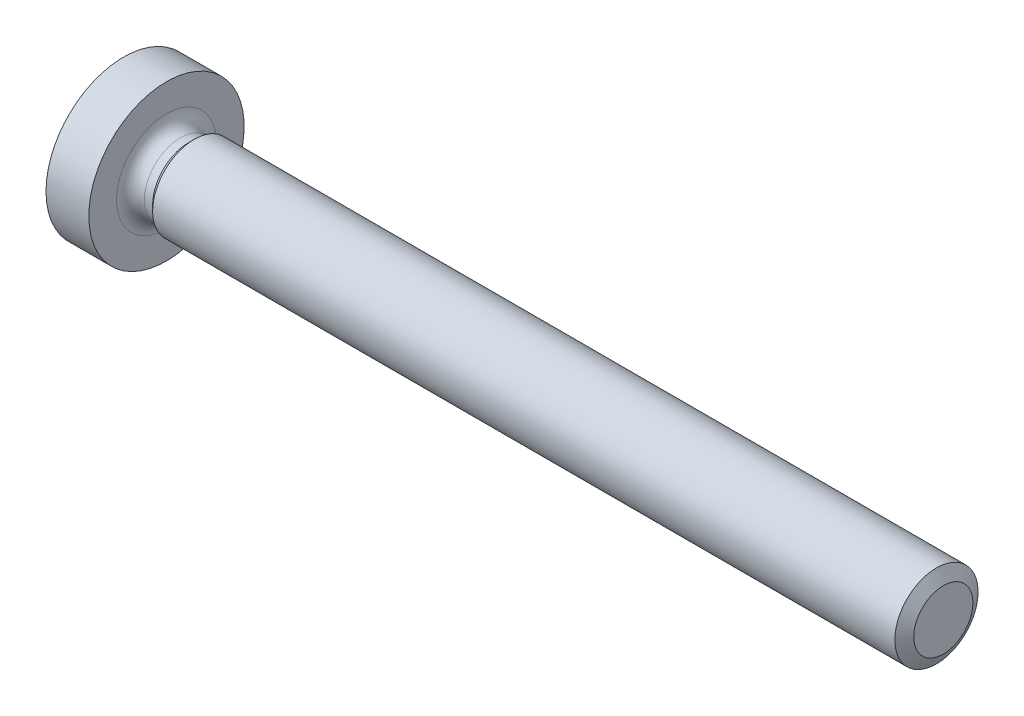
ISO-10303-21;
HEADER;
FILE_DESCRIPTION(('STEP AP214'),'2;1');
FILE_NAME('part.step','',(''),(''),'','','');
FILE_SCHEMA(('AUTOMOTIVE_DESIGN { 1 0 10303 214 1 1 1 1 }'));
ENDSEC;
DATA;
#1=APPLICATION_CONTEXT('core data for automotive mechanical design processes');
#2=APPLICATION_PROTOCOL_DEFINITION('international standard','automotive_design',2000,#1);
#3=PRODUCT_CONTEXT('',#1,'mechanical');
#4=PRODUCT('Part','Part','',(#3));
#5=PRODUCT_RELATED_PRODUCT_CATEGORY('part','',(#4));
#6=PRODUCT_DEFINITION_FORMATION('','',#4);
#7=PRODUCT_DEFINITION_CONTEXT('part definition',#1,'design');
#8=PRODUCT_DEFINITION('design','',#6,#7);
#9=PRODUCT_DEFINITION_SHAPE('','',#8);
#10=(LENGTH_UNIT() NAMED_UNIT(*) SI_UNIT(.MILLI.,.METRE.));
#11=(NAMED_UNIT(*) PLANE_ANGLE_UNIT() SI_UNIT($,.RADIAN.));
#12=(NAMED_UNIT(*) SI_UNIT($,.STERADIAN.) SOLID_ANGLE_UNIT());
#13=UNCERTAINTY_MEASURE_WITH_UNIT(LENGTH_MEASURE(1.E-05),#10,'distance_accuracy_value','');
#14=(GEOMETRIC_REPRESENTATION_CONTEXT(3) GLOBAL_UNCERTAINTY_ASSIGNED_CONTEXT((#13)) GLOBAL_UNIT_ASSIGNED_CONTEXT((#10,
#11,#12)) REPRESENTATION_CONTEXT('',''));
#15=CARTESIAN_POINT('',(0.,0.,0.));
#16=DIRECTION('',(0.,0.,1.));
#17=DIRECTION('',(1.,0.,0.));
#18=AXIS2_PLACEMENT_3D('',#15,#16,#17);
#19=CARTESIAN_POINT('',(1.8,0.,0.));
#20=DIRECTION('',(0.137568371274688,0.,-0.990492273177751));
#21=DIRECTION('',(-0.990492273177752,0.,-0.137568371274688));
#22=AXIS2_PLACEMENT_3D('',#19,#20,#21);
#23=PLANE('',#22);
#24=DIRECTION('',(-0.763885421064628,-0.636571184220523,-0.106095197370087));
#25=VECTOR('',#24,1.);
#26=CARTESIAN_POINT('',(1.8,0.,0.));
#27=LINE('',#26,#25);
#28=CARTESIAN_POINT('',(1.8,0.,0.));
#29=VERTEX_POINT('',#28);
#30=CARTESIAN_POINT('',(0.188839901093437,-1.34263341575547,-0.223772235959245));
#31=VERTEX_POINT('',#30);
#32=EDGE_CURVE('E168',#29,#31,#27,.T.);
#33=ORIENTED_EDGE('',*,*,#32,.F.);
#34=DIRECTION('',(-0.981250680241291,-0.136284816700179,-0.136284816700179));
#35=VECTOR('',#34,1.);
#36=CARTESIAN_POINT('',(1.8,0.,0.));
#37=LINE('',#36,#35);
#38=CARTESIAN_POINT('',(0.0123443765883179,-0.248285503251622,-0.248285503251623));
#39=VERTEX_POINT('',#38);
#40=EDGE_CURVE('E129',#29,#39,#37,.T.);
#41=ORIENTED_EDGE('',*,*,#40,.T.);
#42=CARTESIAN_POINT('',(4.93943981831946,0.,0.436033308099924));
#43=DIRECTION('',(0.137568371274688,0.,-0.990492273177751));
#44=DIRECTION('',(-0.990492273177752,0.,-0.137568371274688));
#45=AXIS2_PLACEMENT_3D('',#42,#43,#44);
#46=CIRCLE('',#45,4.98058304002877);
#47=EDGE_CURVE('E142',#31,#39,#46,.T.);
#48=ORIENTED_EDGE('',*,*,#47,.F.);
#49=EDGE_LOOP('',(#33,#41,#48));
#50=FACE_BOUND('',#49,.T.);
#51=ADVANCED_FACE('F49',(#50),#23,.F.);
#52=CARTESIAN_POINT('',(1.8,0.,0.));
#53=DIRECTION('',(0.137568371274688,0.,0.990492273177752));
#54=DIRECTION('',(0.990492273177752,0.,-0.137568371274688));
#55=AXIS2_PLACEMENT_3D('',#52,#53,#54);
#56=PLANE('',#55);
#57=CARTESIAN_POINT('',(4.93943981831946,0.,-0.436033308099924));
#58=DIRECTION('',(0.137568371274688,0.,0.990492273177752));
#59=DIRECTION('',(0.990492273177752,0.,-0.137568371274688));
#60=AXIS2_PLACEMENT_3D('',#57,#58,#59);
#61=CIRCLE('',#60,4.98058304002877);
#62=CARTESIAN_POINT('',(0.0123443765883179,-0.248285503251624,0.248285503251622));
#63=VERTEX_POINT('',#62);
#64=CARTESIAN_POINT('',(0.188839901093437,-1.34263341575547,0.223772235959245));
#65=VERTEX_POINT('',#64);
#66=EDGE_CURVE('E72',#63,#65,#61,.T.);
#67=ORIENTED_EDGE('',*,*,#66,.F.);
#68=DIRECTION('',(0.981250680241291,0.13628481670018,-0.136284816700179));
#69=VECTOR('',#68,1.);
#70=CARTESIAN_POINT('',(1.8,0.,0.));
#71=LINE('',#70,#69);
#72=EDGE_CURVE('E13',#63,#29,#71,.T.);
#73=ORIENTED_EDGE('',*,*,#72,.T.);
#74=DIRECTION('',(-0.763885421064628,-0.636571184220523,0.106095197370087));
#75=VECTOR('',#74,1.);
#76=CARTESIAN_POINT('',(1.8,0.,0.));
#77=LINE('',#76,#75);
#78=EDGE_CURVE('E169',#29,#65,#77,.T.);
#79=ORIENTED_EDGE('',*,*,#78,.T.);
#80=EDGE_LOOP('',(#67,#73,#79));
#81=FACE_BOUND('',#80,.T.);
#82=ADVANCED_FACE('F184',(#81),#56,.F.);
#83=CARTESIAN_POINT('',(-1.33175770411172,0.,0.));
#84=DIRECTION('',(-1.,0.,0.));
#85=DIRECTION('',(0.,0.,1.));
#86=AXIS2_PLACEMENT_3D('',#83,#84,#85);
#87=CYLINDRICAL_SURFACE('',#86,1.5);
#88=CARTESIAN_POINT('',(3.4,0.,0.));
#89=DIRECTION('',(-1.,0.,0.));
#90=DIRECTION('',(0.,0.,1.));
#91=AXIS2_PLACEMENT_3D('',#88,#89,#90);
#92=CIRCLE('',#91,1.5);
#93=CARTESIAN_POINT('',(3.4,0.,1.5));
#94=VERTEX_POINT('',#93);
#95=EDGE_CURVE('E205',#94,#94,#92,.T.);
#96=ORIENTED_EDGE('',*,*,#95,.F.);
#97=EDGE_LOOP('',(#96));
#98=FACE_BOUND('',#97,.T.);
#99=CARTESIAN_POINT('',(30.1527080028722,0.,0.));
#100=DIRECTION('',(-1.,0.,0.));
#101=DIRECTION('',(0.,0.,1.));
#102=AXIS2_PLACEMENT_3D('',#99,#100,#101);
#103=CIRCLE('',#102,1.5);
#104=CARTESIAN_POINT('',(30.1527080028722,0.,1.5));
#105=VERTEX_POINT('',#104);
#106=EDGE_CURVE('E202',#105,#105,#103,.T.);
#107=ORIENTED_EDGE('',*,*,#106,.T.);
#108=EDGE_LOOP('',(#107));
#109=FACE_BOUND('',#108,.T.);
#110=ADVANCED_FACE('F249',(#98,#109),#87,.T.);
#111=CARTESIAN_POINT('',(5.,0.,0.));
#112=DIRECTION('',(-1.,0.,0.));
#113=DIRECTION('',(0.,1.,0.));
#114=AXIS2_PLACEMENT_3D('',#111,#112,#113);
#115=SPHERICAL_SURFACE('',#114,5.);
#116=CARTESIAN_POINT('',(3.68852459016393,0.,-1.57377049180328));
#117=DIRECTION('',(0.64018439966448,0.,0.768221279597376));
#118=DIRECTION('',(0.768221279597376,0.,-0.64018439966448));
#119=AXIS2_PLACEMENT_3D('',#116,#117,#118);
#120=CIRCLE('',#119,4.56106113624062);
#121=CARTESIAN_POINT('',(0.188839901093437,0.22377223595924,1.34263341575547));
#122=VERTEX_POINT('',#121);
#123=CARTESIAN_POINT('',(0.188839901093437,-0.22377223595925,1.34263341575547));
#124=VERTEX_POINT('',#123);
#125=EDGE_CURVE('E135',#122,#124,#120,.T.);
#126=ORIENTED_EDGE('',*,*,#125,.T.);
#127=CARTESIAN_POINT('',(4.93943981831946,0.436033308099924,0.));
#128=DIRECTION('',(0.137568371274688,-0.990492273177751,0.));
#129=DIRECTION('',(0.990492273177752,0.137568371274688,0.));
#130=AXIS2_PLACEMENT_3D('',#127,#128,#129);
#131=CIRCLE('',#130,4.98058304002877);
#132=EDGE_CURVE('E151',#124,#63,#131,.T.);
#133=ORIENTED_EDGE('',*,*,#132,.T.);
#134=ORIENTED_EDGE('',*,*,#66,.T.);
#135=CARTESIAN_POINT('',(3.68852459016393,1.57377049180328,0.));
#136=DIRECTION('',(0.64018439966448,-0.768221279597376,0.));
#137=DIRECTION('',(0.768221279597376,0.64018439966448,0.));
#138=AXIS2_PLACEMENT_3D('',#135,#136,#137);
#139=CIRCLE('',#138,4.56106113624062);
#140=EDGE_CURVE('E181',#65,#31,#139,.T.);
#141=ORIENTED_EDGE('',*,*,#140,.T.);
#142=ORIENTED_EDGE('',*,*,#47,.T.);
#143=CARTESIAN_POINT('',(0.188839901093437,-0.22377223595924,-1.34263341575547));
#144=VERTEX_POINT('',#143);
#145=EDGE_CURVE('E131',#39,#144,#131,.T.);
#146=ORIENTED_EDGE('',*,*,#145,.T.);
#147=CARTESIAN_POINT('',(3.68852459016393,0.,1.57377049180328));
#148=DIRECTION('',(0.64018439966448,0.,-0.768221279597376));
#149=DIRECTION('',(-0.768221279597376,0.,-0.64018439966448));
#150=AXIS2_PLACEMENT_3D('',#147,#148,#149);
#151=CIRCLE('',#150,4.56106113624062);
#152=CARTESIAN_POINT('',(0.188839901093437,0.223772235959249,-1.34263341575547));
#153=VERTEX_POINT('',#152);
#154=EDGE_CURVE('E123',#144,#153,#151,.T.);
#155=ORIENTED_EDGE('',*,*,#154,.T.);
#156=CARTESIAN_POINT('',(4.93943981831946,-0.436033308099924,0.));
#157=DIRECTION('',(0.137568371274688,0.990492273177752,0.));
#158=DIRECTION('',(-0.990492273177752,0.137568371274688,0.));
#159=AXIS2_PLACEMENT_3D('',#156,#157,#158);
#160=CIRCLE('',#159,4.98058304002877);
#161=CARTESIAN_POINT('',(0.0123443765883179,0.248285503251624,-0.248285503251623));
#162=VERTEX_POINT('',#161);
#163=EDGE_CURVE('E114',#153,#162,#160,.T.);
#164=ORIENTED_EDGE('',*,*,#163,.T.);
#165=CARTESIAN_POINT('',(0.188839901093437,1.34263341575547,-0.223772235959245));
#166=VERTEX_POINT('',#165);
#167=EDGE_CURVE('E159',#162,#166,#46,.T.);
#168=ORIENTED_EDGE('',*,*,#167,.T.);
#169=CARTESIAN_POINT('',(3.68852459016393,-1.57377049180328,0.));
#170=DIRECTION('',(0.64018439966448,0.768221279597376,0.));
#171=DIRECTION('',(-0.768221279597376,0.64018439966448,0.));
#172=AXIS2_PLACEMENT_3D('',#169,#170,#171);
#173=CIRCLE('',#172,4.56106113624062);
#174=CARTESIAN_POINT('',(0.188839901093437,1.34263341575547,0.223772235959245));
#175=VERTEX_POINT('',#174);
#176=EDGE_CURVE('E172',#166,#175,#173,.T.);
#177=ORIENTED_EDGE('',*,*,#176,.T.);
#178=CARTESIAN_POINT('',(0.0123443765883179,0.248285503251622,0.248285503251622));
#179=VERTEX_POINT('',#178);
#180=EDGE_CURVE('E164',#175,#179,#61,.T.);
#181=ORIENTED_EDGE('',*,*,#180,.T.);
#182=EDGE_CURVE('E64',#179,#122,#160,.T.);
#183=ORIENTED_EDGE('',*,*,#182,.T.);
#184=EDGE_LOOP('',(#126,#133,#134,#141,#142,#146,#155,#164,#168,#177,#181,#183));
#185=FACE_BOUND('',#184,.T.);
#186=CARTESIAN_POINT('',(0.857536964558404,0.,0.));
#187=DIRECTION('',(-1.,0.,0.));
#188=DIRECTION('',(0.,0.,1.));
#189=AXIS2_PLACEMENT_3D('',#186,#187,#188);
#190=CIRCLE('',#189,2.8);
#191=CARTESIAN_POINT('',(0.857536964558404,0.,2.8));
#192=VERTEX_POINT('',#191);
#193=EDGE_CURVE('E185',#192,#192,#190,.T.);
#194=ORIENTED_EDGE('',*,*,#193,.T.);
#195=EDGE_LOOP('',(#194));
#196=FACE_BOUND('',#195,.T.);
#197=ADVANCED_FACE('F51',(#185,#196),#115,.T.);
#198=CARTESIAN_POINT('',(-1.33175770411172,0.,0.));
#199=DIRECTION('',(-1.,0.,0.));
#200=DIRECTION('',(0.,0.,1.));
#201=AXIS2_PLACEMENT_3D('',#198,#199,#200);
#202=CYLINDRICAL_SURFACE('',#201,2.8);
#203=ORIENTED_EDGE('',*,*,#193,.F.);
#204=EDGE_LOOP('',(#203));
#205=FACE_BOUND('',#204,.T.);
#206=CARTESIAN_POINT('',(2.4,0.,0.));
#207=DIRECTION('',(-1.,0.,0.));
#208=DIRECTION('',(0.,0.,1.));
#209=AXIS2_PLACEMENT_3D('',#206,#207,#208);
#210=CIRCLE('',#209,2.8);
#211=CARTESIAN_POINT('',(2.4,0.,2.8));
#212=VERTEX_POINT('',#211);
#213=EDGE_CURVE('E188',#212,#212,#210,.T.);
#214=ORIENTED_EDGE('',*,*,#213,.T.);
#215=EDGE_LOOP('',(#214));
#216=FACE_BOUND('',#215,.T.);
#217=ADVANCED_FACE('F222',(#205,#216),#202,.T.);
#218=CARTESIAN_POINT('',(2.4,1.8,0.));
#219=DIRECTION('',(-1.,0.,0.));
#220=DIRECTION('',(0.,0.,1.));
#221=AXIS2_PLACEMENT_3D('',#218,#219,#220);
#222=PLANE('',#221);
#223=ORIENTED_EDGE('',*,*,#213,.F.);
#224=EDGE_LOOP('',(#223));
#225=FACE_BOUND('',#224,.T.);
#226=CARTESIAN_POINT('',(2.4,0.,0.));
#227=DIRECTION('',(-1.,0.,0.));
#228=DIRECTION('',(0.,0.,1.));
#229=AXIS2_PLACEMENT_3D('',#226,#227,#228);
#230=CIRCLE('',#229,1.8);
#231=CARTESIAN_POINT('',(2.4,0.,1.8));
#232=VERTEX_POINT('',#231);
#233=EDGE_CURVE('E214',#232,#232,#230,.T.);
#234=ORIENTED_EDGE('',*,*,#233,.T.);
#235=EDGE_LOOP('',(#234));
#236=FACE_BOUND('',#235,.T.);
#237=ADVANCED_FACE('F224',(#225,#236),#222,.F.);
#238=CARTESIAN_POINT('',(2.901,0.,0.));
#239=DIRECTION('',(-1.,0.,0.));
#240=DIRECTION('',(0.,0.,1.));
#241=AXIS2_PLACEMENT_3D('',#238,#239,#240);
#242=TOROIDAL_SURFACE('',#241,1.8,0.501);
#243=ORIENTED_EDGE('',*,*,#233,.F.);
#244=EDGE_LOOP('',(#243));
#245=FACE_BOUND('',#244,.T.);
#246=CARTESIAN_POINT('',(2.901,0.,0.));
#247=DIRECTION('',(-1.,0.,0.));
#248=DIRECTION('',(0.,0.,1.));
#249=AXIS2_PLACEMENT_3D('',#246,#247,#248);
#250=CIRCLE('',#249,1.299);
#251=CARTESIAN_POINT('',(2.901,0.,1.299));
#252=VERTEX_POINT('',#251);
#253=EDGE_CURVE('E211',#252,#252,#250,.T.);
#254=ORIENTED_EDGE('',*,*,#253,.T.);
#255=EDGE_LOOP('',(#254));
#256=FACE_BOUND('',#255,.T.);
#257=ADVANCED_FACE('F227',(#245,#256),#242,.F.);
#258=CARTESIAN_POINT('',(-1.33175770411172,0.,0.));
#259=DIRECTION('',(-1.,0.,0.));
#260=DIRECTION('',(0.,0.,1.));
#261=AXIS2_PLACEMENT_3D('',#258,#259,#260);
#262=CYLINDRICAL_SURFACE('',#261,1.299);
#263=ORIENTED_EDGE('',*,*,#253,.F.);
#264=EDGE_LOOP('',(#263));
#265=FACE_BOUND('',#264,.T.);
#266=CARTESIAN_POINT('',(3.199,0.,0.));
#267=DIRECTION('',(-1.,0.,0.));
#268=DIRECTION('',(0.,0.,1.));
#269=AXIS2_PLACEMENT_3D('',#266,#267,#268);
#270=CIRCLE('',#269,1.299);
#271=CARTESIAN_POINT('',(3.199,0.,1.299));
#272=VERTEX_POINT('',#271);
#273=EDGE_CURVE('E208',#272,#272,#270,.T.);
#274=ORIENTED_EDGE('',*,*,#273,.T.);
#275=EDGE_LOOP('',(#274));
#276=FACE_BOUND('',#275,.T.);
#277=ADVANCED_FACE('F233',(#265,#276),#262,.T.);
#278=CARTESIAN_POINT('',(3.4,0.,0.));
#279=DIRECTION('',(1.,0.,0.));
#280=DIRECTION('',(0.,0.,-1.));
#281=AXIS2_PLACEMENT_3D('',#278,#279,#280);
#282=CONICAL_SURFACE('',#281,1.5,0.785398163397443);
#283=ORIENTED_EDGE('',*,*,#273,.F.);
#284=EDGE_LOOP('',(#283));
#285=FACE_BOUND('',#284,.T.);
#286=ORIENTED_EDGE('',*,*,#95,.T.);
#287=EDGE_LOOP('',(#286));
#288=FACE_BOUND('',#287,.T.);
#289=ADVANCED_FACE('F239',(#285,#288),#282,.T.);
#290=CARTESIAN_POINT('',(30.1527080028722,0.,0.));
#291=DIRECTION('',(-1.,0.,0.));
#292=DIRECTION('',(0.,0.,1.));
#293=AXIS2_PLACEMENT_3D('',#290,#291,#292);
#294=CONICAL_SURFACE('',#293,1.5,1.05188801855298);
#295=CARTESIAN_POINT('',(30.4,0.,0.));
#296=DIRECTION('',(-1.,0.,0.));
#297=DIRECTION('',(0.,0.,1.));
#298=AXIS2_PLACEMENT_3D('',#295,#296,#297);
#299=CIRCLE('',#298,1.067);
#300=CARTESIAN_POINT('',(30.4,0.,1.067));
#301=VERTEX_POINT('',#300);
#302=EDGE_CURVE('E173',#301,#301,#299,.T.);
#303=ORIENTED_EDGE('',*,*,#302,.T.);
#304=EDGE_LOOP('',(#303));
#305=FACE_BOUND('',#304,.T.);
#306=ORIENTED_EDGE('',*,*,#106,.F.);
#307=EDGE_LOOP('',(#306));
#308=FACE_BOUND('',#307,.T.);
#309=ADVANCED_FACE('F245',(#305,#308),#294,.T.);
#310=CARTESIAN_POINT('',(30.4,0.,0.));
#311=DIRECTION('',(-1.,0.,0.));
#312=DIRECTION('',(0.,0.,1.));
#313=AXIS2_PLACEMENT_3D('',#310,#311,#312);
#314=PLANE('',#313);
#315=ORIENTED_EDGE('',*,*,#302,.F.);
#316=EDGE_LOOP('',(#315));
#317=FACE_BOUND('',#316,.T.);
#318=ADVANCED_FACE('F256',(#317),#314,.F.);
#319=ORIENTED_EDGE('',*,*,#167,.F.);
#320=DIRECTION('',(0.981250680241291,-0.13628481670018,0.136284816700179));
#321=VECTOR('',#320,1.);
#322=CARTESIAN_POINT('',(1.8,0.,0.));
#323=LINE('',#322,#321);
#324=EDGE_CURVE('E112',#162,#29,#323,.T.);
#325=ORIENTED_EDGE('',*,*,#324,.T.);
#326=DIRECTION('',(-0.763885421064628,0.636571184220523,-0.106095197370087));
#327=VECTOR('',#326,1.);
#328=CARTESIAN_POINT('',(1.8,0.,0.));
#329=LINE('',#328,#327);
#330=EDGE_CURVE('E158',#29,#166,#329,.T.);
#331=ORIENTED_EDGE('',*,*,#330,.T.);
#332=EDGE_LOOP('',(#319,#325,#331));
#333=FACE_BOUND('',#332,.T.);
#334=ADVANCED_FACE('F156',(#333),#23,.F.);
#335=CARTESIAN_POINT('',(0.,1.5,-0.25));
#336=DIRECTION('',(0.64018439966448,0.768221279597376,0.));
#337=DIRECTION('',(-0.768221279597376,0.64018439966448,0.));
#338=AXIS2_PLACEMENT_3D('',#335,#336,#337);
#339=PLANE('',#338);
#340=ORIENTED_EDGE('',*,*,#330,.F.);
#341=DIRECTION('',(-0.763885421064628,0.636571184220523,0.106095197370087));
#342=VECTOR('',#341,1.);
#343=CARTESIAN_POINT('',(1.8,0.,0.));
#344=LINE('',#343,#342);
#345=EDGE_CURVE('E162',#29,#175,#344,.T.);
#346=ORIENTED_EDGE('',*,*,#345,.T.);
#347=ORIENTED_EDGE('',*,*,#176,.F.);
#348=EDGE_LOOP('',(#340,#346,#347));
#349=FACE_BOUND('',#348,.T.);
#350=ADVANCED_FACE('F171',(#349),#339,.F.);
#351=CARTESIAN_POINT('',(0.,-1.5,0.25));
#352=DIRECTION('',(0.64018439966448,-0.768221279597376,0.));
#353=DIRECTION('',(0.768221279597376,0.64018439966448,0.));
#354=AXIS2_PLACEMENT_3D('',#351,#352,#353);
#355=PLANE('',#354);
#356=ORIENTED_EDGE('',*,*,#78,.F.);
#357=ORIENTED_EDGE('',*,*,#32,.T.);
#358=ORIENTED_EDGE('',*,*,#140,.F.);
#359=EDGE_LOOP('',(#356,#357,#358));
#360=FACE_BOUND('',#359,.T.);
#361=ADVANCED_FACE('F180',(#360),#355,.F.);
#362=ORIENTED_EDGE('',*,*,#345,.F.);
#363=DIRECTION('',(-0.981250680241291,0.136284816700179,0.136284816700179));
#364=VECTOR('',#363,1.);
#365=CARTESIAN_POINT('',(1.8,0.,0.));
#366=LINE('',#365,#364);
#367=EDGE_CURVE('E57',#29,#179,#366,.T.);
#368=ORIENTED_EDGE('',*,*,#367,.T.);
#369=ORIENTED_EDGE('',*,*,#180,.F.);
#370=EDGE_LOOP('',(#362,#368,#369));
#371=FACE_BOUND('',#370,.T.);
#372=ADVANCED_FACE('F163',(#371),#56,.F.);
#373=CARTESIAN_POINT('',(1.8,0.,0.));
#374=DIRECTION('',(0.137568371274688,-0.990492273177751,0.));
#375=DIRECTION('',(-0.990492273177752,-0.137568371274688,0.));
#376=AXIS2_PLACEMENT_3D('',#373,#374,#375);
#377=PLANE('',#376);
#378=DIRECTION('',(-0.763885421064628,-0.106095197370089,0.636571184220523));
#379=VECTOR('',#378,1.);
#380=CARTESIAN_POINT('',(1.8,0.,0.));
#381=LINE('',#380,#379);
#382=EDGE_CURVE('E126',#29,#124,#381,.T.);
#383=ORIENTED_EDGE('',*,*,#382,.F.);
#384=ORIENTED_EDGE('',*,*,#72,.F.);
#385=ORIENTED_EDGE('',*,*,#132,.F.);
#386=EDGE_LOOP('',(#383,#384,#385));
#387=FACE_BOUND('',#386,.T.);
#388=ADVANCED_FACE('F150',(#387),#377,.F.);
#389=CARTESIAN_POINT('',(1.8,0.,0.));
#390=DIRECTION('',(0.137568371274688,0.990492273177752,0.));
#391=DIRECTION('',(0.990492273177752,-0.137568371274688,0.));
#392=AXIS2_PLACEMENT_3D('',#389,#390,#391);
#393=PLANE('',#392);
#394=ORIENTED_EDGE('',*,*,#367,.F.);
#395=DIRECTION('',(-0.763885421064628,0.106095197370085,0.636571184220523));
#396=VECTOR('',#395,1.);
#397=CARTESIAN_POINT('',(1.8,0.,0.));
#398=LINE('',#397,#396);
#399=EDGE_CURVE('E117',#29,#122,#398,.T.);
#400=ORIENTED_EDGE('',*,*,#399,.T.);
#401=ORIENTED_EDGE('',*,*,#182,.F.);
#402=EDGE_LOOP('',(#394,#400,#401));
#403=FACE_BOUND('',#402,.T.);
#404=ADVANCED_FACE('F138',(#403),#393,.F.);
#405=CARTESIAN_POINT('',(0.,-0.250000000000005,1.5));
#406=DIRECTION('',(0.64018439966448,0.,0.768221279597376));
#407=DIRECTION('',(-0.768221279597376,0.,0.64018439966448));
#408=AXIS2_PLACEMENT_3D('',#405,#406,#407);
#409=PLANE('',#408);
#410=ORIENTED_EDGE('',*,*,#399,.F.);
#411=ORIENTED_EDGE('',*,*,#382,.T.);
#412=ORIENTED_EDGE('',*,*,#125,.F.);
#413=EDGE_LOOP('',(#410,#411,#412));
#414=FACE_BOUND('',#413,.T.);
#415=ADVANCED_FACE('F146',(#414),#409,.F.);
#416=ORIENTED_EDGE('',*,*,#40,.F.);
#417=DIRECTION('',(-0.763885421064628,-0.106095197370085,-0.636571184220523));
#418=VECTOR('',#417,1.);
#419=CARTESIAN_POINT('',(1.8,0.,0.));
#420=LINE('',#419,#418);
#421=EDGE_CURVE('E120',#29,#144,#420,.T.);
#422=ORIENTED_EDGE('',*,*,#421,.T.);
#423=ORIENTED_EDGE('',*,*,#145,.F.);
#424=EDGE_LOOP('',(#416,#422,#423));
#425=FACE_BOUND('',#424,.T.);
#426=ADVANCED_FACE('F130',(#425),#377,.F.);
#427=CARTESIAN_POINT('',(0.,0.250000000000005,-1.5));
#428=DIRECTION('',(0.64018439966448,0.,-0.768221279597376));
#429=DIRECTION('',(0.768221279597376,0.,0.64018439966448));
#430=AXIS2_PLACEMENT_3D('',#427,#428,#429);
#431=PLANE('',#430);
#432=ORIENTED_EDGE('',*,*,#421,.F.);
#433=DIRECTION('',(-0.763885421064628,0.106095197370089,-0.636571184220523));
#434=VECTOR('',#433,1.);
#435=CARTESIAN_POINT('',(1.8,0.,0.));
#436=LINE('',#435,#434);
#437=EDGE_CURVE('E108',#29,#153,#436,.T.);
#438=ORIENTED_EDGE('',*,*,#437,.T.);
#439=ORIENTED_EDGE('',*,*,#154,.F.);
#440=EDGE_LOOP('',(#432,#438,#439));
#441=FACE_BOUND('',#440,.T.);
#442=ADVANCED_FACE('F122',(#441),#431,.F.);
#443=ORIENTED_EDGE('',*,*,#437,.F.);
#444=ORIENTED_EDGE('',*,*,#324,.F.);
#445=ORIENTED_EDGE('',*,*,#163,.F.);
#446=EDGE_LOOP('',(#443,#444,#445));
#447=FACE_BOUND('',#446,.T.);
#448=ADVANCED_FACE('F110',(#447),#393,.F.);
#449=CLOSED_SHELL('',(#51,#82,#110,#197,#217,#237,#257,#277,#289,#309,#318,#334,#350,#361,#372,
#388,#404,#415,#426,#442,#448));
#450=MANIFOLD_SOLID_BREP('B2',#449);
#451=ADVANCED_BREP_SHAPE_REPRESENTATION('',(#18,#450),#14);
#452=SHAPE_DEFINITION_REPRESENTATION(#9,#451);
ENDSEC;
END-ISO-10303-21;
